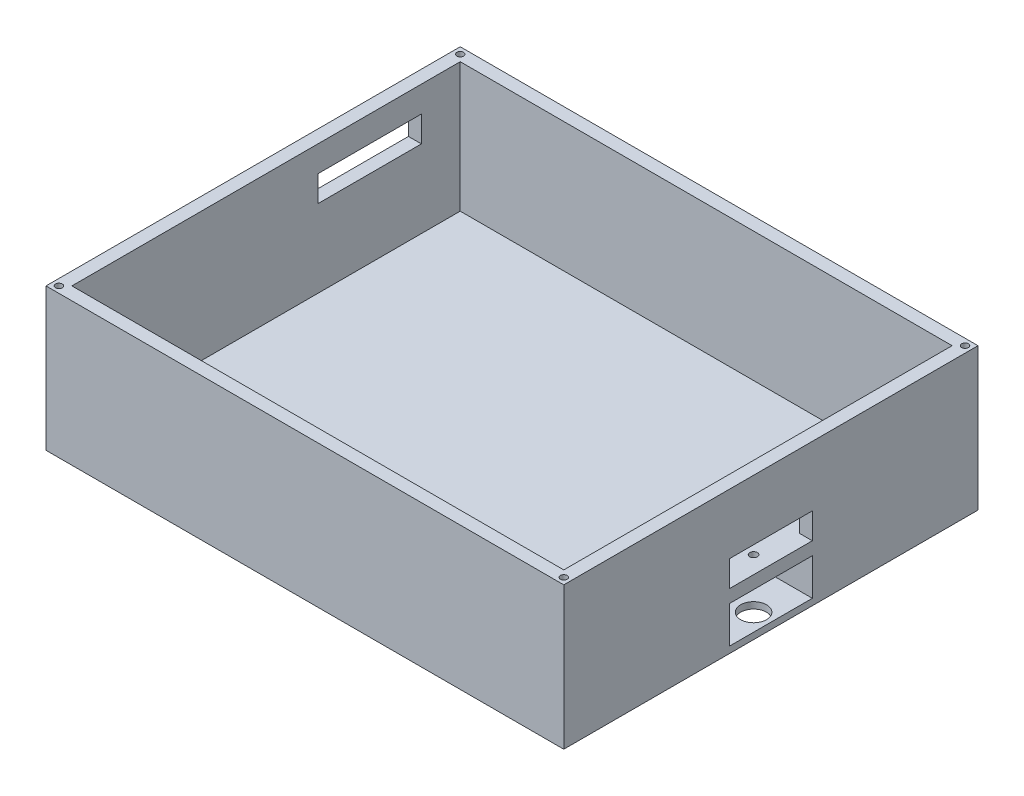
ISO-10303-21;
HEADER;
FILE_DESCRIPTION(('STEP AP214'),'2;1');
FILE_NAME('part.step','',(''),(''),'','','');
FILE_SCHEMA(('AUTOMOTIVE_DESIGN { 1 0 10303 214 1 1 1 1 }'));
ENDSEC;
DATA;
#1=APPLICATION_CONTEXT('core data for automotive mechanical design processes');
#2=APPLICATION_PROTOCOL_DEFINITION('international standard','automotive_design',2000,#1);
#3=PRODUCT_CONTEXT('',#1,'mechanical');
#4=PRODUCT('Part','Part','',(#3));
#5=PRODUCT_RELATED_PRODUCT_CATEGORY('part','',(#4));
#6=PRODUCT_DEFINITION_FORMATION('','',#4);
#7=PRODUCT_DEFINITION_CONTEXT('part definition',#1,'design');
#8=PRODUCT_DEFINITION('design','',#6,#7);
#9=PRODUCT_DEFINITION_SHAPE('','',#8);
#10=(LENGTH_UNIT() NAMED_UNIT(*) SI_UNIT(.MILLI.,.METRE.));
#11=(NAMED_UNIT(*) PLANE_ANGLE_UNIT() SI_UNIT($,.RADIAN.));
#12=(NAMED_UNIT(*) SI_UNIT($,.STERADIAN.) SOLID_ANGLE_UNIT());
#13=UNCERTAINTY_MEASURE_WITH_UNIT(LENGTH_MEASURE(1.E-05),#10,'distance_accuracy_value','');
#14=(GEOMETRIC_REPRESENTATION_CONTEXT(3) GLOBAL_UNCERTAINTY_ASSIGNED_CONTEXT((#13)) GLOBAL_UNIT_ASSIGNED_CONTEXT((#10,
#11,#12)) REPRESENTATION_CONTEXT('',''));
#15=CARTESIAN_POINT('',(0.,0.,0.));
#16=DIRECTION('',(0.,0.,1.));
#17=DIRECTION('',(1.,0.,0.));
#18=AXIS2_PLACEMENT_3D('',#15,#16,#17);
#19=CARTESIAN_POINT('',(120.65,-34.7831022413822,20.32));
#20=DIRECTION('',(0.,0.,1.));
#21=DIRECTION('',(1.,0.,0.));
#22=AXIS2_PLACEMENT_3D('',#19,#20,#21);
#23=PLANE('',#22);
#24=DIRECTION('',(-1.,0.,0.));
#25=VECTOR('',#24,1.);
#26=CARTESIAN_POINT('',(120.65,21.262951806,20.32));
#27=LINE('',#26,#25);
#28=CARTESIAN_POINT('',(127.,21.262951806,20.32));
#29=VERTEX_POINT('',#28);
#30=CARTESIAN_POINT('',(88.9,21.262951806,20.32));
#31=VERTEX_POINT('',#30);
#32=EDGE_CURVE('E266',#29,#31,#27,.T.);
#33=ORIENTED_EDGE('',*,*,#32,.F.);
#34=DIRECTION('',(0.,1.,0.));
#35=VECTOR('',#34,1.);
#36=CARTESIAN_POINT('',(127.,-34.7831022413822,20.32));
#37=LINE('',#36,#35);
#38=CARTESIAN_POINT('',(127.,3.175,20.32));
#39=VERTEX_POINT('',#38);
#40=EDGE_CURVE('E348',#39,#29,#37,.T.);
#41=ORIENTED_EDGE('',*,*,#40,.F.);
#42=DIRECTION('',(1.,0.,0.));
#43=VECTOR('',#42,1.);
#44=CARTESIAN_POINT('',(127.,3.175,20.32));
#45=LINE('',#44,#43);
#46=CARTESIAN_POINT('',(76.2,3.175,20.32));
#47=VERTEX_POINT('',#46);
#48=EDGE_CURVE('E325',#47,#39,#45,.T.);
#49=ORIENTED_EDGE('',*,*,#48,.F.);
#50=DIRECTION('',(0.,1.,0.));
#51=VECTOR('',#50,1.);
#52=CARTESIAN_POINT('',(76.2,3.175,20.32));
#53=LINE('',#52,#51);
#54=CARTESIAN_POINT('',(76.2,6.35,20.32));
#55=VERTEX_POINT('',#54);
#56=EDGE_CURVE('E335',#47,#55,#53,.T.);
#57=ORIENTED_EDGE('',*,*,#56,.T.);
#58=DIRECTION('',(1.,0.,0.));
#59=VECTOR('',#58,1.);
#60=CARTESIAN_POINT('',(127.,6.35,20.32));
#61=LINE('',#60,#59);
#62=CARTESIAN_POINT('',(88.9,6.35,20.32));
#63=VERTEX_POINT('',#62);
#64=EDGE_CURVE('E319',#55,#63,#61,.T.);
#65=ORIENTED_EDGE('',*,*,#64,.T.);
#66=DIRECTION('',(0.,-1.,0.));
#67=VECTOR('',#66,1.);
#68=CARTESIAN_POINT('',(88.9,53.6417257173142,20.32));
#69=LINE('',#68,#67);
#70=EDGE_CURVE('E270',#31,#63,#69,.T.);
#71=ORIENTED_EDGE('',*,*,#70,.F.);
#72=EDGE_LOOP('',(#33,#41,#49,#57,#65,#71));
#73=FACE_BOUND('',#72,.T.);
#74=ADVANCED_FACE('F41',(#73),#23,.F.);
#75=CARTESIAN_POINT('',(120.65,-34.7831022413822,-20.32));
#76=DIRECTION('',(0.,0.,-1.));
#77=DIRECTION('',(-1.,0.,0.));
#78=AXIS2_PLACEMENT_3D('',#75,#76,#77);
#79=PLANE('',#78);
#80=DIRECTION('',(0.,1.,0.));
#81=VECTOR('',#80,1.);
#82=CARTESIAN_POINT('',(127.,-34.7831022413822,-20.32));
#83=LINE('',#82,#81);
#84=CARTESIAN_POINT('',(127.,3.175,-20.32));
#85=VERTEX_POINT('',#84);
#86=CARTESIAN_POINT('',(127.,21.262951806,-20.32));
#87=VERTEX_POINT('',#86);
#88=EDGE_CURVE('E344',#85,#87,#83,.T.);
#89=ORIENTED_EDGE('',*,*,#88,.T.);
#90=DIRECTION('',(-1.,0.,0.));
#91=VECTOR('',#90,1.);
#92=CARTESIAN_POINT('',(120.65,21.262951806,-20.32));
#93=LINE('',#92,#91);
#94=CARTESIAN_POINT('',(88.9,21.262951806,-20.32));
#95=VERTEX_POINT('',#94);
#96=EDGE_CURVE('E311',#87,#95,#93,.T.);
#97=ORIENTED_EDGE('',*,*,#96,.T.);
#98=DIRECTION('',(0.,-1.,0.));
#99=VECTOR('',#98,1.);
#100=CARTESIAN_POINT('',(88.9,53.6417257173142,-20.32));
#101=LINE('',#100,#99);
#102=CARTESIAN_POINT('',(88.9,6.35,-20.32));
#103=VERTEX_POINT('',#102);
#104=EDGE_CURVE('E302',#95,#103,#101,.T.);
#105=ORIENTED_EDGE('',*,*,#104,.T.);
#106=DIRECTION('',(-1.,0.,0.));
#107=VECTOR('',#106,1.);
#108=CARTESIAN_POINT('',(127.,6.35,-20.32));
#109=LINE('',#108,#107);
#110=CARTESIAN_POINT('',(76.2,6.35,-20.32));
#111=VERTEX_POINT('',#110);
#112=EDGE_CURVE('E314',#103,#111,#109,.T.);
#113=ORIENTED_EDGE('',*,*,#112,.T.);
#114=DIRECTION('',(0.,1.,0.));
#115=VECTOR('',#114,1.);
#116=CARTESIAN_POINT('',(76.2,3.175,-20.32));
#117=LINE('',#116,#115);
#118=CARTESIAN_POINT('',(76.2,3.175,-20.32));
#119=VERTEX_POINT('',#118);
#120=EDGE_CURVE('E328',#119,#111,#117,.T.);
#121=ORIENTED_EDGE('',*,*,#120,.F.);
#122=DIRECTION('',(-1.,0.,0.));
#123=VECTOR('',#122,1.);
#124=CARTESIAN_POINT('',(127.,3.175,-20.32));
#125=LINE('',#124,#123);
#126=EDGE_CURVE('E318',#85,#119,#125,.T.);
#127=ORIENTED_EDGE('',*,*,#126,.F.);
#128=EDGE_LOOP('',(#89,#97,#105,#113,#121,#127));
#129=FACE_BOUND('',#128,.T.);
#130=ADVANCED_FACE('F575',(#129),#79,.F.);
#131=CARTESIAN_POINT('',(0.,6.35,0.));
#132=DIRECTION('',(0.,-1.,0.));
#133=DIRECTION('',(0.,0.,-1.));
#134=AXIS2_PLACEMENT_3D('',#131,#132,#133);
#135=PLANE('',#134);
#136=DIRECTION('',(-1.,0.,0.));
#137=VECTOR('',#136,1.);
#138=CARTESIAN_POINT('',(120.65,6.35,26.67));
#139=LINE('',#138,#137);
#140=CARTESIAN_POINT('',(120.65,6.35,26.67));
#141=VERTEX_POINT('',#140);
#142=CARTESIAN_POINT('',(88.9,6.35,26.67));
#143=VERTEX_POINT('',#142);
#144=EDGE_CURVE('E273',#141,#143,#139,.T.);
#145=ORIENTED_EDGE('',*,*,#144,.T.);
#146=DIRECTION('',(0.,0.,-1.));
#147=VECTOR('',#146,1.);
#148=CARTESIAN_POINT('',(88.9,6.35,20.32));
#149=LINE('',#148,#147);
#150=EDGE_CURVE('E265',#143,#63,#149,.T.);
#151=ORIENTED_EDGE('',*,*,#150,.T.);
#152=ORIENTED_EDGE('',*,*,#64,.F.);
#153=DIRECTION('',(0.,0.,1.));
#154=VECTOR('',#153,1.);
#155=CARTESIAN_POINT('',(76.2,6.35,-20.32));
#156=LINE('',#155,#154);
#157=EDGE_CURVE('E330',#111,#55,#156,.T.);
#158=ORIENTED_EDGE('',*,*,#157,.F.);
#159=ORIENTED_EDGE('',*,*,#112,.F.);
#160=DIRECTION('',(0.,0.,1.));
#161=VECTOR('',#160,1.);
#162=CARTESIAN_POINT('',(88.9,6.35,-20.32));
#163=LINE('',#162,#161);
#164=CARTESIAN_POINT('',(88.9,6.35,-26.67));
#165=VERTEX_POINT('',#164);
#166=EDGE_CURVE('E299',#165,#103,#163,.T.);
#167=ORIENTED_EDGE('',*,*,#166,.F.);
#168=DIRECTION('',(-1.,0.,0.));
#169=VECTOR('',#168,1.);
#170=CARTESIAN_POINT('',(120.65,6.35,-26.67));
#171=LINE('',#170,#169);
#172=CARTESIAN_POINT('',(120.65,6.35,-26.67));
#173=VERTEX_POINT('',#172);
#174=EDGE_CURVE('E296',#173,#165,#171,.T.);
#175=ORIENTED_EDGE('',*,*,#174,.F.);
#176=DIRECTION('',(0.,0.,1.));
#177=VECTOR('',#176,1.);
#178=CARTESIAN_POINT('',(120.65,6.35,0.));
#179=LINE('',#178,#177);
#180=CARTESIAN_POINT('',(120.65,6.35,-95.25));
#181=VERTEX_POINT('',#180);
#182=EDGE_CURVE('E373',#181,#173,#179,.T.);
#183=ORIENTED_EDGE('',*,*,#182,.F.);
#184=DIRECTION('',(1.,0.,0.));
#185=VECTOR('',#184,1.);
#186=CARTESIAN_POINT('',(0.,6.35,-95.25));
#187=LINE('',#186,#185);
#188=CARTESIAN_POINT('',(-120.65,6.35,-95.25));
#189=VERTEX_POINT('',#188);
#190=EDGE_CURVE('E356',#189,#181,#187,.T.);
#191=ORIENTED_EDGE('',*,*,#190,.F.);
#192=DIRECTION('',(0.,0.,-1.));
#193=VECTOR('',#192,1.);
#194=CARTESIAN_POINT('',(-120.65,6.35,0.));
#195=LINE('',#194,#193);
#196=CARTESIAN_POINT('',(-120.65,6.35,95.25));
#197=VERTEX_POINT('',#196);
#198=EDGE_CURVE('E379',#197,#189,#195,.T.);
#199=ORIENTED_EDGE('',*,*,#198,.F.);
#200=DIRECTION('',(-1.,0.,0.));
#201=VECTOR('',#200,1.);
#202=CARTESIAN_POINT('',(0.,6.35,95.25));
#203=LINE('',#202,#201);
#204=CARTESIAN_POINT('',(120.65,6.35,95.25));
#205=VERTEX_POINT('',#204);
#206=EDGE_CURVE('E376',#205,#197,#203,.T.);
#207=ORIENTED_EDGE('',*,*,#206,.F.);
#208=EDGE_CURVE('E352',#141,#205,#179,.T.);
#209=ORIENTED_EDGE('',*,*,#208,.F.);
#210=EDGE_LOOP('',(#145,#151,#152,#158,#159,#167,#175,#183,#191,#199,#207,#209));
#211=FACE_BOUND('',#210,.T.);
#212=ADVANCED_FACE('F457',(#211),#135,.F.);
#213=CARTESIAN_POINT('',(120.65,69.85,0.));
#214=DIRECTION('',(1.,0.,0.));
#215=DIRECTION('',(0.,0.,-1.));
#216=AXIS2_PLACEMENT_3D('',#213,#214,#215);
#217=PLANE('',#216);
#218=DIRECTION('',(0.,0.,1.));
#219=VECTOR('',#218,1.);
#220=CARTESIAN_POINT('',(120.65,27.612951806,0.));
#221=LINE('',#220,#219);
#222=CARTESIAN_POINT('',(120.65,27.612951806,20.32));
#223=VERTEX_POINT('',#222);
#224=CARTESIAN_POINT('',(120.65,27.612951806,26.67));
#225=VERTEX_POINT('',#224);
#226=EDGE_CURVE('E262',#223,#225,#221,.T.);
#227=ORIENTED_EDGE('',*,*,#226,.T.);
#228=DIRECTION('',(0.,-1.,0.));
#229=VECTOR('',#228,1.);
#230=CARTESIAN_POINT('',(120.65,53.6417257173142,26.67));
#231=LINE('',#230,#229);
#232=EDGE_CURVE('E276',#225,#141,#231,.T.);
#233=ORIENTED_EDGE('',*,*,#232,.T.);
#234=ORIENTED_EDGE('',*,*,#208,.T.);
#235=DIRECTION('',(0.,-1.,0.));
#236=VECTOR('',#235,1.);
#237=CARTESIAN_POINT('',(120.65,69.85,95.25));
#238=LINE('',#237,#236);
#239=CARTESIAN_POINT('',(120.65,69.85,95.25));
#240=VERTEX_POINT('',#239);
#241=EDGE_CURVE('E392',#240,#205,#238,.T.);
#242=ORIENTED_EDGE('',*,*,#241,.F.);
#243=DIRECTION('',(0.,0.,1.));
#244=VECTOR('',#243,1.);
#245=CARTESIAN_POINT('',(120.65,69.85,0.));
#246=LINE('',#245,#244);
#247=CARTESIAN_POINT('',(120.65,69.85,-95.25));
#248=VERTEX_POINT('',#247);
#249=EDGE_CURVE('E353',#248,#240,#246,.T.);
#250=ORIENTED_EDGE('',*,*,#249,.F.);
#251=DIRECTION('',(0.,-1.,0.));
#252=VECTOR('',#251,1.);
#253=CARTESIAN_POINT('',(120.65,69.85,-95.25));
#254=LINE('',#253,#252);
#255=EDGE_CURVE('E372',#248,#181,#254,.T.);
#256=ORIENTED_EDGE('',*,*,#255,.T.);
#257=ORIENTED_EDGE('',*,*,#182,.T.);
#258=DIRECTION('',(0.,-1.,0.));
#259=VECTOR('',#258,1.);
#260=CARTESIAN_POINT('',(120.65,53.6417257173142,-26.67));
#261=LINE('',#260,#259);
#262=CARTESIAN_POINT('',(120.65,27.612951806,-26.67));
#263=VERTEX_POINT('',#262);
#264=EDGE_CURVE('E308',#263,#173,#261,.T.);
#265=ORIENTED_EDGE('',*,*,#264,.F.);
#266=DIRECTION('',(0.,0.,1.));
#267=VECTOR('',#266,1.);
#268=CARTESIAN_POINT('',(120.65,27.612951806,0.));
#269=LINE('',#268,#267);
#270=CARTESIAN_POINT('',(120.65,27.612951806,-20.32));
#271=VERTEX_POINT('',#270);
#272=EDGE_CURVE('E290',#263,#271,#269,.T.);
#273=ORIENTED_EDGE('',*,*,#272,.T.);
#274=DIRECTION('',(0.,1.,0.));
#275=VECTOR('',#274,1.);
#276=CARTESIAN_POINT('',(120.65,-34.7831022413822,-20.32));
#277=LINE('',#276,#275);
#278=CARTESIAN_POINT('',(120.65,40.312951806,-20.32));
#279=VERTEX_POINT('',#278);
#280=EDGE_CURVE('E340',#271,#279,#277,.T.);
#281=ORIENTED_EDGE('',*,*,#280,.T.);
#282=DIRECTION('',(0.,0.,1.));
#283=VECTOR('',#282,1.);
#284=CARTESIAN_POINT('',(120.65,40.312951806,20.32));
#285=LINE('',#284,#283);
#286=CARTESIAN_POINT('',(120.65,40.312951806,20.32));
#287=VERTEX_POINT('',#286);
#288=EDGE_CURVE('E477',#279,#287,#285,.T.);
#289=ORIENTED_EDGE('',*,*,#288,.T.);
#290=DIRECTION('',(0.,1.,0.));
#291=VECTOR('',#290,1.);
#292=CARTESIAN_POINT('',(120.65,-34.7831022413822,20.32));
#293=LINE('',#292,#291);
#294=EDGE_CURVE('E343',#223,#287,#293,.T.);
#295=ORIENTED_EDGE('',*,*,#294,.F.);
#296=EDGE_LOOP('',(#227,#233,#234,#242,#250,#256,#257,#265,#273,#281,#289,#295));
#297=FACE_BOUND('',#296,.T.);
#298=ADVANCED_FACE('F451',(#297),#217,.F.);
#299=CARTESIAN_POINT('',(127.,6.35,101.6));
#300=DIRECTION('',(-1.,0.,0.));
#301=DIRECTION('',(0.,0.,1.));
#302=AXIS2_PLACEMENT_3D('',#299,#300,#301);
#303=PLANE('',#302);
#304=CARTESIAN_POINT('',(127.,27.612951806,20.32));
#305=VERTEX_POINT('',#304);
#306=CARTESIAN_POINT('',(127.,40.312951806,20.32));
#307=VERTEX_POINT('',#306);
#308=EDGE_CURVE('E337',#305,#307,#37,.T.);
#309=ORIENTED_EDGE('',*,*,#308,.T.);
#310=DIRECTION('',(0.,0.,-1.));
#311=VECTOR('',#310,1.);
#312=CARTESIAN_POINT('',(127.,40.312951806,20.32));
#313=LINE('',#312,#311);
#314=CARTESIAN_POINT('',(127.,40.312951806,-20.32));
#315=VERTEX_POINT('',#314);
#316=EDGE_CURVE('E487',#307,#315,#313,.T.);
#317=ORIENTED_EDGE('',*,*,#316,.T.);
#318=CARTESIAN_POINT('',(127.,27.612951806,-20.32));
#319=VERTEX_POINT('',#318);
#320=EDGE_CURVE('E347',#319,#315,#83,.T.);
#321=ORIENTED_EDGE('',*,*,#320,.F.);
#322=DIRECTION('',(0.,0.,-1.));
#323=VECTOR('',#322,1.);
#324=CARTESIAN_POINT('',(127.,27.612951806,-26.67));
#325=LINE('',#324,#323);
#326=EDGE_CURVE('E284',#305,#319,#325,.T.);
#327=ORIENTED_EDGE('',*,*,#326,.F.);
#328=EDGE_LOOP('',(#309,#317,#321,#327));
#329=FACE_BOUND('',#328,.T.);
#330=DIRECTION('',(0.,-1.,0.));
#331=VECTOR('',#330,1.);
#332=CARTESIAN_POINT('',(127.,6.35,-101.6));
#333=LINE('',#332,#331);
#334=CARTESIAN_POINT('',(127.,69.85,-101.6));
#335=VERTEX_POINT('',#334);
#336=CARTESIAN_POINT('',(127.,0.,-101.6));
#337=VERTEX_POINT('',#336);
#338=EDGE_CURVE('E49',#335,#337,#333,.T.);
#339=ORIENTED_EDGE('',*,*,#338,.F.);
#340=DIRECTION('',(0.,0.,-1.));
#341=VECTOR('',#340,1.);
#342=CARTESIAN_POINT('',(127.,69.85,0.));
#343=LINE('',#342,#341);
#344=CARTESIAN_POINT('',(127.,69.85,101.6));
#345=VERTEX_POINT('',#344);
#346=EDGE_CURVE('E367',#345,#335,#343,.T.);
#347=ORIENTED_EDGE('',*,*,#346,.F.);
#348=DIRECTION('',(0.,-1.,0.));
#349=VECTOR('',#348,1.);
#350=CARTESIAN_POINT('',(127.,6.35,101.6));
#351=LINE('',#350,#349);
#352=CARTESIAN_POINT('',(127.,0.,101.6));
#353=VERTEX_POINT('',#352);
#354=EDGE_CURVE('E404',#345,#353,#351,.T.);
#355=ORIENTED_EDGE('',*,*,#354,.T.);
#356=DIRECTION('',(0.,0.,-1.));
#357=VECTOR('',#356,1.);
#358=CARTESIAN_POINT('',(127.,0.,101.6));
#359=LINE('',#358,#357);
#360=EDGE_CURVE('E395',#353,#337,#359,.T.);
#361=ORIENTED_EDGE('',*,*,#360,.T.);
#362=EDGE_LOOP('',(#339,#347,#355,#361));
#363=FACE_BOUND('',#362,.T.);
#364=ORIENTED_EDGE('',*,*,#40,.T.);
#365=DIRECTION('',(0.,0.,-1.));
#366=VECTOR('',#365,1.);
#367=CARTESIAN_POINT('',(127.,21.262951806,-26.67));
#368=LINE('',#367,#366);
#369=EDGE_CURVE('E285',#29,#87,#368,.T.);
#370=ORIENTED_EDGE('',*,*,#369,.T.);
#371=ORIENTED_EDGE('',*,*,#88,.F.);
#372=DIRECTION('',(0.,0.,-1.));
#373=VECTOR('',#372,1.);
#374=CARTESIAN_POINT('',(127.,3.175,-20.32));
#375=LINE('',#374,#373);
#376=EDGE_CURVE('E315',#39,#85,#375,.T.);
#377=ORIENTED_EDGE('',*,*,#376,.F.);
#378=EDGE_LOOP('',(#364,#370,#371,#377));
#379=FACE_BOUND('',#378,.T.);
#380=ADVANCED_FACE('F43',(#329,#363,#379),#303,.F.);
#381=CARTESIAN_POINT('',(-127.,6.35,-101.6));
#382=DIRECTION('',(0.,0.,1.));
#383=DIRECTION('',(1.,0.,0.));
#384=AXIS2_PLACEMENT_3D('',#381,#382,#383);
#385=PLANE('',#384);
#386=DIRECTION('',(-1.,0.,0.));
#387=VECTOR('',#386,1.);
#388=CARTESIAN_POINT('',(-127.,0.,-101.6));
#389=LINE('',#388,#387);
#390=CARTESIAN_POINT('',(-127.,0.,-101.6));
#391=VERTEX_POINT('',#390);
#392=EDGE_CURVE('E398',#337,#391,#389,.T.);
#393=ORIENTED_EDGE('',*,*,#392,.T.);
#394=DIRECTION('',(0.,-1.,0.));
#395=VECTOR('',#394,1.);
#396=CARTESIAN_POINT('',(-127.,6.35,-101.6));
#397=LINE('',#396,#395);
#398=CARTESIAN_POINT('',(-127.,69.85,-101.6));
#399=VERTEX_POINT('',#398);
#400=EDGE_CURVE('E410',#399,#391,#397,.T.);
#401=ORIENTED_EDGE('',*,*,#400,.F.);
#402=DIRECTION('',(-1.,0.,0.));
#403=VECTOR('',#402,1.);
#404=CARTESIAN_POINT('',(0.,69.85,-101.6));
#405=LINE('',#404,#403);
#406=EDGE_CURVE('E369',#335,#399,#405,.T.);
#407=ORIENTED_EDGE('',*,*,#406,.F.);
#408=ORIENTED_EDGE('',*,*,#338,.T.);
#409=EDGE_LOOP('',(#393,#401,#407,#408));
#410=FACE_BOUND('',#409,.T.);
#411=ADVANCED_FACE('F416',(#410),#385,.F.);
#412=CARTESIAN_POINT('',(-127.,6.35,101.6));
#413=DIRECTION('',(1.,0.,0.));
#414=DIRECTION('',(0.,0.,-1.));
#415=AXIS2_PLACEMENT_3D('',#412,#413,#414);
#416=PLANE('',#415);
#417=DIRECTION('',(0.,1.,0.));
#418=VECTOR('',#417,1.);
#419=CARTESIAN_POINT('',(-127.,44.45,-76.2));
#420=LINE('',#419,#418);
#421=CARTESIAN_POINT('',(-127.,44.45,-76.2));
#422=VERTEX_POINT('',#421);
#423=CARTESIAN_POINT('',(-127.,57.15,-76.2));
#424=VERTEX_POINT('',#423);
#425=EDGE_CURVE('E229',#422,#424,#420,.T.);
#426=ORIENTED_EDGE('',*,*,#425,.T.);
#427=DIRECTION('',(0.,0.,1.));
#428=VECTOR('',#427,1.);
#429=CARTESIAN_POINT('',(-127.,57.15,-76.2));
#430=LINE('',#429,#428);
#431=CARTESIAN_POINT('',(-127.,57.15,-25.4));
#432=VERTEX_POINT('',#431);
#433=EDGE_CURVE('E217',#424,#432,#430,.T.);
#434=ORIENTED_EDGE('',*,*,#433,.T.);
#435=DIRECTION('',(0.,1.,0.));
#436=VECTOR('',#435,1.);
#437=CARTESIAN_POINT('',(-127.,44.45,-25.4));
#438=LINE('',#437,#436);
#439=CARTESIAN_POINT('',(-127.,44.45,-25.4));
#440=VERTEX_POINT('',#439);
#441=EDGE_CURVE('E228',#440,#432,#438,.T.);
#442=ORIENTED_EDGE('',*,*,#441,.F.);
#443=DIRECTION('',(0.,0.,1.));
#444=VECTOR('',#443,1.);
#445=CARTESIAN_POINT('',(-127.,44.45,-76.2));
#446=LINE('',#445,#444);
#447=EDGE_CURVE('E504',#422,#440,#446,.T.);
#448=ORIENTED_EDGE('',*,*,#447,.F.);
#449=EDGE_LOOP('',(#426,#434,#442,#448));
#450=FACE_BOUND('',#449,.T.);
#451=DIRECTION('',(0.,-1.,0.));
#452=VECTOR('',#451,1.);
#453=CARTESIAN_POINT('',(-127.,6.35,101.6));
#454=LINE('',#453,#452);
#455=CARTESIAN_POINT('',(-127.,69.85,101.6));
#456=VERTEX_POINT('',#455);
#457=CARTESIAN_POINT('',(-127.,0.,101.6));
#458=VERTEX_POINT('',#457);
#459=EDGE_CURVE('E407',#456,#458,#454,.T.);
#460=ORIENTED_EDGE('',*,*,#459,.F.);
#461=DIRECTION('',(0.,0.,1.));
#462=VECTOR('',#461,1.);
#463=CARTESIAN_POINT('',(-127.,69.85,0.));
#464=LINE('',#463,#462);
#465=EDGE_CURVE('E362',#399,#456,#464,.T.);
#466=ORIENTED_EDGE('',*,*,#465,.F.);
#467=ORIENTED_EDGE('',*,*,#400,.T.);
#468=DIRECTION('',(0.,0.,1.));
#469=VECTOR('',#468,1.);
#470=CARTESIAN_POINT('',(-127.,0.,101.6));
#471=LINE('',#470,#469);
#472=EDGE_CURVE('E400',#391,#458,#471,.T.);
#473=ORIENTED_EDGE('',*,*,#472,.T.);
#474=EDGE_LOOP('',(#460,#466,#467,#473));
#475=FACE_BOUND('',#474,.T.);
#476=ADVANCED_FACE('F225',(#450,#475),#416,.F.);
#477=CARTESIAN_POINT('',(-127.,6.35,101.6));
#478=DIRECTION('',(0.,0.,-1.));
#479=DIRECTION('',(-1.,0.,0.));
#480=AXIS2_PLACEMENT_3D('',#477,#478,#479);
#481=PLANE('',#480);
#482=DIRECTION('',(1.,0.,0.));
#483=VECTOR('',#482,1.);
#484=CARTESIAN_POINT('',(-127.,0.,101.6));
#485=LINE('',#484,#483);
#486=EDGE_CURVE('E402',#458,#353,#485,.T.);
#487=ORIENTED_EDGE('',*,*,#486,.T.);
#488=ORIENTED_EDGE('',*,*,#354,.F.);
#489=DIRECTION('',(1.,0.,0.));
#490=VECTOR('',#489,1.);
#491=CARTESIAN_POINT('',(0.,69.85,101.6));
#492=LINE('',#491,#490);
#493=EDGE_CURVE('E364',#456,#345,#492,.T.);
#494=ORIENTED_EDGE('',*,*,#493,.F.);
#495=ORIENTED_EDGE('',*,*,#459,.T.);
#496=EDGE_LOOP('',(#487,#488,#494,#495));
#497=FACE_BOUND('',#496,.T.);
#498=ADVANCED_FACE('F429',(#497),#481,.F.);
#499=CARTESIAN_POINT('',(0.,0.,0.));
#500=DIRECTION('',(0.,-1.,0.));
#501=DIRECTION('',(0.,0.,-1.));
#502=AXIS2_PLACEMENT_3D('',#499,#500,#501);
#503=PLANE('',#502);
#504=CARTESIAN_POINT('',(99.4,0.,0.));
#505=DIRECTION('',(0.,-1.,0.));
#506=DIRECTION('',(0.,0.,-1.));
#507=AXIS2_PLACEMENT_3D('',#504,#505,#506);
#508=CIRCLE('',#507,6.34999999999997);
#509=CARTESIAN_POINT('',(99.4,0.,-6.34999999999998));
#510=VERTEX_POINT('',#509);
#511=EDGE_CURVE('E505',#510,#510,#508,.T.);
#512=ORIENTED_EDGE('',*,*,#511,.F.);
#513=EDGE_LOOP('',(#512));
#514=FACE_BOUND('',#513,.T.);
#515=CARTESIAN_POINT('',(118.5,0.,0.));
#516=DIRECTION('',(0.,-1.,0.));
#517=DIRECTION('',(0.,0.,-1.));
#518=AXIS2_PLACEMENT_3D('',#515,#516,#517);
#519=CIRCLE('',#518,6.34999999999997);
#520=CARTESIAN_POINT('',(118.5,0.,-6.34999999999998));
#521=VERTEX_POINT('',#520);
#522=EDGE_CURVE('E508',#521,#521,#519,.T.);
#523=ORIENTED_EDGE('',*,*,#522,.F.);
#524=EDGE_LOOP('',(#523));
#525=FACE_BOUND('',#524,.T.);
#526=ORIENTED_EDGE('',*,*,#360,.F.);
#527=ORIENTED_EDGE('',*,*,#486,.F.);
#528=ORIENTED_EDGE('',*,*,#472,.F.);
#529=ORIENTED_EDGE('',*,*,#392,.F.);
#530=EDGE_LOOP('',(#526,#527,#528,#529));
#531=FACE_BOUND('',#530,.T.);
#532=ADVANCED_FACE('F423',(#514,#525,#531),#503,.T.);
#533=CARTESIAN_POINT('',(0.,69.85,95.25));
#534=DIRECTION('',(0.,0.,1.));
#535=DIRECTION('',(1.,0.,0.));
#536=AXIS2_PLACEMENT_3D('',#533,#534,#535);
#537=PLANE('',#536);
#538=ORIENTED_EDGE('',*,*,#206,.T.);
#539=DIRECTION('',(0.,-1.,0.));
#540=VECTOR('',#539,1.);
#541=CARTESIAN_POINT('',(-120.65,69.85,95.25));
#542=LINE('',#541,#540);
#543=CARTESIAN_POINT('',(-120.65,69.85,95.25));
#544=VERTEX_POINT('',#543);
#545=EDGE_CURVE('E389',#544,#197,#542,.T.);
#546=ORIENTED_EDGE('',*,*,#545,.F.);
#547=DIRECTION('',(-1.,0.,0.));
#548=VECTOR('',#547,1.);
#549=CARTESIAN_POINT('',(0.,69.85,95.25));
#550=LINE('',#549,#548);
#551=EDGE_CURVE('E355',#240,#544,#550,.T.);
#552=ORIENTED_EDGE('',*,*,#551,.F.);
#553=ORIENTED_EDGE('',*,*,#241,.T.);
#554=EDGE_LOOP('',(#538,#546,#552,#553));
#555=FACE_BOUND('',#554,.T.);
#556=ADVANCED_FACE('F453',(#555),#537,.F.);
#557=CARTESIAN_POINT('',(-120.65,69.85,0.));
#558=DIRECTION('',(-1.,0.,0.));
#559=DIRECTION('',(0.,0.,1.));
#560=AXIS2_PLACEMENT_3D('',#557,#558,#559);
#561=PLANE('',#560);
#562=DIRECTION('',(0.,-1.,0.));
#563=VECTOR('',#562,1.);
#564=CARTESIAN_POINT('',(-120.65,69.85,-95.25));
#565=LINE('',#564,#563);
#566=CARTESIAN_POINT('',(-120.65,69.85,-95.25));
#567=VERTEX_POINT('',#566);
#568=EDGE_CURVE('E386',#567,#189,#565,.T.);
#569=ORIENTED_EDGE('',*,*,#568,.F.);
#570=DIRECTION('',(0.,0.,-1.));
#571=VECTOR('',#570,1.);
#572=CARTESIAN_POINT('',(-120.65,69.85,0.));
#573=LINE('',#572,#571);
#574=EDGE_CURVE('E358',#544,#567,#573,.T.);
#575=ORIENTED_EDGE('',*,*,#574,.F.);
#576=ORIENTED_EDGE('',*,*,#545,.T.);
#577=ORIENTED_EDGE('',*,*,#198,.T.);
#578=EDGE_LOOP('',(#569,#575,#576,#577));
#579=FACE_BOUND('',#578,.T.);
#580=DIRECTION('',(0.,0.,-1.));
#581=VECTOR('',#580,1.);
#582=CARTESIAN_POINT('',(-120.65,57.15,-76.2));
#583=LINE('',#582,#581);
#584=CARTESIAN_POINT('',(-120.65,57.15,-25.4));
#585=VERTEX_POINT('',#584);
#586=CARTESIAN_POINT('',(-120.65,57.15,-76.2));
#587=VERTEX_POINT('',#586);
#588=EDGE_CURVE('E218',#585,#587,#583,.T.);
#589=ORIENTED_EDGE('',*,*,#588,.T.);
#590=DIRECTION('',(0.,1.,0.));
#591=VECTOR('',#590,1.);
#592=CARTESIAN_POINT('',(-120.65,44.45,-76.2));
#593=LINE('',#592,#591);
#594=CARTESIAN_POINT('',(-120.65,44.45,-76.2));
#595=VERTEX_POINT('',#594);
#596=EDGE_CURVE('E56',#595,#587,#593,.T.);
#597=ORIENTED_EDGE('',*,*,#596,.F.);
#598=DIRECTION('',(0.,0.,-1.));
#599=VECTOR('',#598,1.);
#600=CARTESIAN_POINT('',(-120.65,44.45,-76.2));
#601=LINE('',#600,#599);
#602=CARTESIAN_POINT('',(-120.65,44.45,-25.4));
#603=VERTEX_POINT('',#602);
#604=EDGE_CURVE('E241',#603,#595,#601,.T.);
#605=ORIENTED_EDGE('',*,*,#604,.F.);
#606=DIRECTION('',(0.,1.,0.));
#607=VECTOR('',#606,1.);
#608=CARTESIAN_POINT('',(-120.65,44.45,-25.4));
#609=LINE('',#608,#607);
#610=EDGE_CURVE('E236',#603,#585,#609,.T.);
#611=ORIENTED_EDGE('',*,*,#610,.T.);
#612=EDGE_LOOP('',(#589,#597,#605,#611));
#613=FACE_BOUND('',#612,.T.);
#614=ADVANCED_FACE('F445',(#579,#613),#561,.F.);
#615=CARTESIAN_POINT('',(0.,69.85,-95.25));
#616=DIRECTION('',(0.,0.,-1.));
#617=DIRECTION('',(-1.,0.,0.));
#618=AXIS2_PLACEMENT_3D('',#615,#616,#617);
#619=PLANE('',#618);
#620=ORIENTED_EDGE('',*,*,#190,.T.);
#621=ORIENTED_EDGE('',*,*,#255,.F.);
#622=DIRECTION('',(1.,0.,0.));
#623=VECTOR('',#622,1.);
#624=CARTESIAN_POINT('',(0.,69.85,-95.25));
#625=LINE('',#624,#623);
#626=EDGE_CURVE('E360',#567,#248,#625,.T.);
#627=ORIENTED_EDGE('',*,*,#626,.F.);
#628=ORIENTED_EDGE('',*,*,#568,.T.);
#629=EDGE_LOOP('',(#620,#621,#627,#628));
#630=FACE_BOUND('',#629,.T.);
#631=ADVANCED_FACE('F435',(#630),#619,.F.);
#632=CARTESIAN_POINT('',(0.,69.85,0.));
#633=DIRECTION('',(0.,1.,0.));
#634=DIRECTION('',(0.,0.,1.));
#635=AXIS2_PLACEMENT_3D('',#632,#633,#634);
#636=PLANE('',#635);
#637=CARTESIAN_POINT('',(123.825,69.85,98.425));
#638=DIRECTION('',(0.,1.,0.));
#639=DIRECTION('',(0.,0.,-1.));
#640=AXIS2_PLACEMENT_3D('',#637,#638,#639);
#641=CIRCLE('',#640,1.65);
#642=CARTESIAN_POINT('',(123.825,69.85,96.775));
#643=VERTEX_POINT('',#642);
#644=EDGE_CURVE('E539',#643,#643,#641,.T.);
#645=ORIENTED_EDGE('',*,*,#644,.F.);
#646=EDGE_LOOP('',(#645));
#647=FACE_BOUND('',#646,.T.);
#648=CARTESIAN_POINT('',(-123.825,69.85,98.425));
#649=DIRECTION('',(0.,-1.,0.));
#650=DIRECTION('',(0.,0.,-1.));
#651=AXIS2_PLACEMENT_3D('',#648,#649,#650);
#652=CIRCLE('',#651,1.65);
#653=CARTESIAN_POINT('',(-123.825,69.85,96.775));
#654=VERTEX_POINT('',#653);
#655=EDGE_CURVE('E533',#654,#654,#652,.T.);
#656=ORIENTED_EDGE('',*,*,#655,.T.);
#657=EDGE_LOOP('',(#656));
#658=FACE_BOUND('',#657,.T.);
#659=CARTESIAN_POINT('',(123.825,69.85,-98.425));
#660=DIRECTION('',(0.,-1.,0.));
#661=DIRECTION('',(0.,0.,1.));
#662=AXIS2_PLACEMENT_3D('',#659,#660,#661);
#663=CIRCLE('',#662,1.65);
#664=CARTESIAN_POINT('',(123.825,69.85,-96.775));
#665=VERTEX_POINT('',#664);
#666=EDGE_CURVE('E527',#665,#665,#663,.T.);
#667=ORIENTED_EDGE('',*,*,#666,.T.);
#668=EDGE_LOOP('',(#667));
#669=FACE_BOUND('',#668,.T.);
#670=CARTESIAN_POINT('',(-123.825,69.85,-98.425));
#671=DIRECTION('',(0.,1.,0.));
#672=DIRECTION('',(0.,0.,1.));
#673=AXIS2_PLACEMENT_3D('',#670,#671,#672);
#674=CIRCLE('',#673,1.65);
#675=CARTESIAN_POINT('',(-123.825,69.85,-96.775));
#676=VERTEX_POINT('',#675);
#677=EDGE_CURVE('E521',#676,#676,#674,.T.);
#678=ORIENTED_EDGE('',*,*,#677,.F.);
#679=EDGE_LOOP('',(#678));
#680=FACE_BOUND('',#679,.T.);
#681=ORIENTED_EDGE('',*,*,#465,.T.);
#682=ORIENTED_EDGE('',*,*,#493,.T.);
#683=ORIENTED_EDGE('',*,*,#346,.T.);
#684=ORIENTED_EDGE('',*,*,#406,.T.);
#685=EDGE_LOOP('',(#681,#682,#683,#684));
#686=FACE_BOUND('',#685,.T.);
#687=ORIENTED_EDGE('',*,*,#574,.T.);
#688=ORIENTED_EDGE('',*,*,#626,.T.);
#689=ORIENTED_EDGE('',*,*,#249,.T.);
#690=ORIENTED_EDGE('',*,*,#551,.T.);
#691=EDGE_LOOP('',(#687,#688,#689,#690));
#692=FACE_BOUND('',#691,.T.);
#693=ADVANCED_FACE('F431',(#647,#658,#669,#680,#686,#692),#636,.T.);
#694=ORIENTED_EDGE('',*,*,#294,.T.);
#695=DIRECTION('',(1.,0.,0.));
#696=VECTOR('',#695,1.);
#697=CARTESIAN_POINT('',(70.4101073248094,40.312951806,20.32));
#698=LINE('',#697,#696);
#699=EDGE_CURVE('E481',#287,#307,#698,.T.);
#700=ORIENTED_EDGE('',*,*,#699,.T.);
#701=ORIENTED_EDGE('',*,*,#308,.F.);
#702=DIRECTION('',(-1.,0.,0.));
#703=VECTOR('',#702,1.);
#704=CARTESIAN_POINT('',(120.65,27.612951806,20.32));
#705=LINE('',#704,#703);
#706=EDGE_CURVE('E260',#305,#223,#705,.T.);
#707=ORIENTED_EDGE('',*,*,#706,.T.);
#708=EDGE_LOOP('',(#694,#700,#701,#707));
#709=FACE_BOUND('',#708,.T.);
#710=ADVANCED_FACE('F434',(#709),#23,.F.);
#711=ORIENTED_EDGE('',*,*,#320,.T.);
#712=DIRECTION('',(1.,0.,0.));
#713=VECTOR('',#712,1.);
#714=CARTESIAN_POINT('',(70.4101073248094,40.312951806,-20.32));
#715=LINE('',#714,#713);
#716=EDGE_CURVE('E492',#279,#315,#715,.T.);
#717=ORIENTED_EDGE('',*,*,#716,.F.);
#718=ORIENTED_EDGE('',*,*,#280,.F.);
#719=DIRECTION('',(1.,0.,0.));
#720=VECTOR('',#719,1.);
#721=CARTESIAN_POINT('',(120.65,27.612951806,-20.32));
#722=LINE('',#721,#720);
#723=EDGE_CURVE('E11',#271,#319,#722,.T.);
#724=ORIENTED_EDGE('',*,*,#723,.T.);
#725=EDGE_LOOP('',(#711,#717,#718,#724));
#726=FACE_BOUND('',#725,.T.);
#727=ADVANCED_FACE('F585',(#726),#79,.F.);
#728=CARTESIAN_POINT('',(76.2,3.175,-20.32));
#729=DIRECTION('',(-1.,0.,0.));
#730=DIRECTION('',(0.,0.,1.));
#731=AXIS2_PLACEMENT_3D('',#728,#729,#730);
#732=PLANE('',#731);
#733=ORIENTED_EDGE('',*,*,#157,.T.);
#734=ORIENTED_EDGE('',*,*,#56,.F.);
#735=DIRECTION('',(0.,0.,1.));
#736=VECTOR('',#735,1.);
#737=CARTESIAN_POINT('',(76.2,3.175,-20.32));
#738=LINE('',#737,#736);
#739=EDGE_CURVE('E322',#119,#47,#738,.T.);
#740=ORIENTED_EDGE('',*,*,#739,.F.);
#741=ORIENTED_EDGE('',*,*,#120,.T.);
#742=EDGE_LOOP('',(#733,#734,#740,#741));
#743=FACE_BOUND('',#742,.T.);
#744=ADVANCED_FACE('F591',(#743),#732,.F.);
#745=CARTESIAN_POINT('',(0.,3.175,0.));
#746=DIRECTION('',(0.,-1.,0.));
#747=DIRECTION('',(0.,0.,-1.));
#748=AXIS2_PLACEMENT_3D('',#745,#746,#747);
#749=PLANE('',#748);
#750=CARTESIAN_POINT('',(99.4,3.175,0.));
#751=DIRECTION('',(0.,-1.,0.));
#752=DIRECTION('',(0.,0.,-1.));
#753=AXIS2_PLACEMENT_3D('',#750,#751,#752);
#754=CIRCLE('',#753,6.34999999999997);
#755=CARTESIAN_POINT('',(99.4,3.175,-6.34999999999998));
#756=VERTEX_POINT('',#755);
#757=EDGE_CURVE('E501',#756,#756,#754,.F.);
#758=ORIENTED_EDGE('',*,*,#757,.F.);
#759=EDGE_LOOP('',(#758));
#760=FACE_BOUND('',#759,.T.);
#761=CARTESIAN_POINT('',(118.5,3.175,0.));
#762=DIRECTION('',(0.,-1.,0.));
#763=DIRECTION('',(0.,0.,-1.));
#764=AXIS2_PLACEMENT_3D('',#761,#762,#763);
#765=CIRCLE('',#764,6.34999999999997);
#766=CARTESIAN_POINT('',(118.5,3.175,-6.34999999999998));
#767=VERTEX_POINT('',#766);
#768=EDGE_CURVE('E500',#767,#767,#765,.F.);
#769=ORIENTED_EDGE('',*,*,#768,.F.);
#770=EDGE_LOOP('',(#769));
#771=FACE_BOUND('',#770,.T.);
#772=ORIENTED_EDGE('',*,*,#376,.T.);
#773=ORIENTED_EDGE('',*,*,#126,.T.);
#774=ORIENTED_EDGE('',*,*,#739,.T.);
#775=ORIENTED_EDGE('',*,*,#48,.T.);
#776=EDGE_LOOP('',(#772,#773,#774,#775));
#777=FACE_BOUND('',#776,.T.);
#778=ADVANCED_FACE('F597',(#760,#771,#777),#749,.F.);
#779=CARTESIAN_POINT('',(88.9,53.6417257173142,-20.32));
#780=DIRECTION('',(1.,0.,0.));
#781=DIRECTION('',(0.,0.,-1.));
#782=AXIS2_PLACEMENT_3D('',#779,#780,#781);
#783=PLANE('',#782);
#784=ORIENTED_EDGE('',*,*,#104,.F.);
#785=DIRECTION('',(0.,0.,1.));
#786=VECTOR('',#785,1.);
#787=CARTESIAN_POINT('',(88.9,21.262951806,-26.67));
#788=LINE('',#787,#786);
#789=EDGE_CURVE('E269',#95,#31,#788,.T.);
#790=ORIENTED_EDGE('',*,*,#789,.T.);
#791=ORIENTED_EDGE('',*,*,#70,.T.);
#792=ORIENTED_EDGE('',*,*,#150,.F.);
#793=DIRECTION('',(0.,-1.,0.));
#794=VECTOR('',#793,1.);
#795=CARTESIAN_POINT('',(88.9,53.6417257173142,26.67));
#796=LINE('',#795,#794);
#797=CARTESIAN_POINT('',(88.9,27.612951806,26.67));
#798=VERTEX_POINT('',#797);
#799=EDGE_CURVE('E279',#798,#143,#796,.T.);
#800=ORIENTED_EDGE('',*,*,#799,.F.);
#801=DIRECTION('',(0.,0.,1.));
#802=VECTOR('',#801,1.);
#803=CARTESIAN_POINT('',(88.9,27.612951806,-26.67));
#804=LINE('',#803,#802);
#805=CARTESIAN_POINT('',(88.9,27.612951806,-26.67));
#806=VERTEX_POINT('',#805);
#807=EDGE_CURVE('E282',#806,#798,#804,.T.);
#808=ORIENTED_EDGE('',*,*,#807,.F.);
#809=DIRECTION('',(0.,-1.,0.));
#810=VECTOR('',#809,1.);
#811=CARTESIAN_POINT('',(88.9,53.6417257173142,-26.67));
#812=LINE('',#811,#810);
#813=EDGE_CURVE('E305',#806,#165,#812,.T.);
#814=ORIENTED_EDGE('',*,*,#813,.T.);
#815=ORIENTED_EDGE('',*,*,#166,.T.);
#816=EDGE_LOOP('',(#784,#790,#791,#792,#800,#808,#814,#815));
#817=FACE_BOUND('',#816,.T.);
#818=ADVANCED_FACE('F469',(#817),#783,.F.);
#819=CARTESIAN_POINT('',(120.65,53.6417257173142,-26.67));
#820=DIRECTION('',(0.,0.,1.));
#821=DIRECTION('',(1.,0.,0.));
#822=AXIS2_PLACEMENT_3D('',#819,#820,#821);
#823=PLANE('',#822);
#824=ORIENTED_EDGE('',*,*,#813,.F.);
#825=DIRECTION('',(-1.,0.,0.));
#826=VECTOR('',#825,1.);
#827=CARTESIAN_POINT('',(88.9,27.612951806,-26.67));
#828=LINE('',#827,#826);
#829=EDGE_CURVE('E287',#263,#806,#828,.T.);
#830=ORIENTED_EDGE('',*,*,#829,.F.);
#831=ORIENTED_EDGE('',*,*,#264,.T.);
#832=ORIENTED_EDGE('',*,*,#174,.T.);
#833=EDGE_LOOP('',(#824,#830,#831,#832));
#834=FACE_BOUND('',#833,.T.);
#835=ADVANCED_FACE('F461',(#834),#823,.F.);
#836=CARTESIAN_POINT('',(0.,27.612951806,0.));
#837=DIRECTION('',(0.,1.,0.));
#838=DIRECTION('',(0.,0.,1.));
#839=AXIS2_PLACEMENT_3D('',#836,#837,#838);
#840=PLANE('',#839);
#841=CARTESIAN_POINT('',(99.4,27.612951806,0.));
#842=DIRECTION('',(0.,1.,0.));
#843=DIRECTION('',(0.,0.,1.));
#844=AXIS2_PLACEMENT_3D('',#841,#842,#843);
#845=CIRCLE('',#844,1.84999999999998);
#846=CARTESIAN_POINT('',(99.4,27.612951806,1.84999999999997));
#847=VERTEX_POINT('',#846);
#848=EDGE_CURVE('E248',#847,#847,#845,.T.);
#849=ORIENTED_EDGE('',*,*,#848,.F.);
#850=EDGE_LOOP('',(#849));
#851=FACE_BOUND('',#850,.T.);
#852=CARTESIAN_POINT('',(118.5,27.612951806,0.));
#853=DIRECTION('',(0.,1.,0.));
#854=DIRECTION('',(0.,0.,1.));
#855=AXIS2_PLACEMENT_3D('',#852,#853,#854);
#856=CIRCLE('',#855,1.84999999999998);
#857=CARTESIAN_POINT('',(118.5,27.612951806,1.84999999999997));
#858=VERTEX_POINT('',#857);
#859=EDGE_CURVE('E253',#858,#858,#856,.T.);
#860=ORIENTED_EDGE('',*,*,#859,.F.);
#861=EDGE_LOOP('',(#860));
#862=FACE_BOUND('',#861,.T.);
#863=ORIENTED_EDGE('',*,*,#272,.F.);
#864=ORIENTED_EDGE('',*,*,#829,.T.);
#865=ORIENTED_EDGE('',*,*,#807,.T.);
#866=DIRECTION('',(-1.,0.,0.));
#867=VECTOR('',#866,1.);
#868=CARTESIAN_POINT('',(88.9,27.612951806,26.67));
#869=LINE('',#868,#867);
#870=EDGE_CURVE('E252',#225,#798,#869,.T.);
#871=ORIENTED_EDGE('',*,*,#870,.F.);
#872=ORIENTED_EDGE('',*,*,#226,.F.);
#873=ORIENTED_EDGE('',*,*,#706,.F.);
#874=ORIENTED_EDGE('',*,*,#326,.T.);
#875=ORIENTED_EDGE('',*,*,#723,.F.);
#876=EDGE_LOOP('',(#863,#864,#865,#871,#872,#873,#874,#875));
#877=FACE_BOUND('',#876,.T.);
#878=ADVANCED_FACE('F464',(#851,#862,#877),#840,.T.);
#879=CARTESIAN_POINT('',(0.,21.262951806,0.));
#880=DIRECTION('',(0.,1.,0.));
#881=DIRECTION('',(0.,0.,1.));
#882=AXIS2_PLACEMENT_3D('',#879,#880,#881);
#883=PLANE('',#882);
#884=CARTESIAN_POINT('',(99.4,21.262951806,0.));
#885=DIRECTION('',(0.,1.,0.));
#886=DIRECTION('',(0.,0.,1.));
#887=AXIS2_PLACEMENT_3D('',#884,#885,#886);
#888=CIRCLE('',#887,1.84999999999998);
#889=CARTESIAN_POINT('',(99.4,21.262951806,1.84999999999997));
#890=VERTEX_POINT('',#889);
#891=EDGE_CURVE('E245',#890,#890,#888,.F.);
#892=ORIENTED_EDGE('',*,*,#891,.F.);
#893=EDGE_LOOP('',(#892));
#894=FACE_BOUND('',#893,.T.);
#895=CARTESIAN_POINT('',(118.5,21.262951806,0.));
#896=DIRECTION('',(0.,1.,0.));
#897=DIRECTION('',(0.,0.,1.));
#898=AXIS2_PLACEMENT_3D('',#895,#896,#897);
#899=CIRCLE('',#898,1.84999999999998);
#900=CARTESIAN_POINT('',(118.5,21.262951806,1.84999999999997));
#901=VERTEX_POINT('',#900);
#902=EDGE_CURVE('E249',#901,#901,#899,.F.);
#903=ORIENTED_EDGE('',*,*,#902,.F.);
#904=EDGE_LOOP('',(#903));
#905=FACE_BOUND('',#904,.T.);
#906=ORIENTED_EDGE('',*,*,#789,.F.);
#907=ORIENTED_EDGE('',*,*,#96,.F.);
#908=ORIENTED_EDGE('',*,*,#369,.F.);
#909=ORIENTED_EDGE('',*,*,#32,.T.);
#910=EDGE_LOOP('',(#906,#907,#908,#909));
#911=FACE_BOUND('',#910,.T.);
#912=ADVANCED_FACE('F607',(#894,#905,#911),#883,.F.);
#913=CARTESIAN_POINT('',(120.65,53.6417257173142,26.67));
#914=DIRECTION('',(0.,0.,1.));
#915=DIRECTION('',(1.,0.,0.));
#916=AXIS2_PLACEMENT_3D('',#913,#914,#915);
#917=PLANE('',#916);
#918=ORIENTED_EDGE('',*,*,#232,.F.);
#919=ORIENTED_EDGE('',*,*,#870,.T.);
#920=ORIENTED_EDGE('',*,*,#799,.T.);
#921=ORIENTED_EDGE('',*,*,#144,.F.);
#922=EDGE_LOOP('',(#918,#919,#920,#921));
#923=FACE_BOUND('',#922,.T.);
#924=ADVANCED_FACE('F472',(#923),#917,.T.);
#925=CARTESIAN_POINT('',(118.5,-0.001000000000001,0.));
#926=DIRECTION('',(0.,1.,0.));
#927=DIRECTION('',(0.,0.,1.));
#928=AXIS2_PLACEMENT_3D('',#925,#926,#927);
#929=CYLINDRICAL_SURFACE('',#928,1.84999999999998);
#930=ORIENTED_EDGE('',*,*,#859,.T.);
#931=EDGE_LOOP('',(#930));
#932=FACE_BOUND('',#931,.T.);
#933=ORIENTED_EDGE('',*,*,#902,.T.);
#934=EDGE_LOOP('',(#933));
#935=FACE_BOUND('',#934,.T.);
#936=ADVANCED_FACE('F616',(#932,#935),#929,.F.);
#937=CARTESIAN_POINT('',(99.4,-0.001000000000001,0.));
#938=DIRECTION('',(0.,1.,0.));
#939=DIRECTION('',(0.,0.,1.));
#940=AXIS2_PLACEMENT_3D('',#937,#938,#939);
#941=CYLINDRICAL_SURFACE('',#940,1.84999999999998);
#942=ORIENTED_EDGE('',*,*,#848,.T.);
#943=EDGE_LOOP('',(#942));
#944=FACE_BOUND('',#943,.T.);
#945=ORIENTED_EDGE('',*,*,#891,.T.);
#946=EDGE_LOOP('',(#945));
#947=FACE_BOUND('',#946,.T.);
#948=ADVANCED_FACE('F619',(#944,#947),#941,.F.);
#949=CARTESIAN_POINT('',(-127.,44.45,-76.2));
#950=DIRECTION('',(0.,0.,-1.));
#951=DIRECTION('',(-1.,0.,0.));
#952=AXIS2_PLACEMENT_3D('',#949,#950,#951);
#953=PLANE('',#952);
#954=ORIENTED_EDGE('',*,*,#596,.T.);
#955=DIRECTION('',(-1.,0.,0.));
#956=VECTOR('',#955,1.);
#957=CARTESIAN_POINT('',(-68.2865585546557,57.15,-76.2));
#958=LINE('',#957,#956);
#959=EDGE_CURVE('E61',#587,#424,#958,.T.);
#960=ORIENTED_EDGE('',*,*,#959,.T.);
#961=ORIENTED_EDGE('',*,*,#425,.F.);
#962=DIRECTION('',(-1.,0.,0.));
#963=VECTOR('',#962,1.);
#964=CARTESIAN_POINT('',(-127.,44.45,-76.2));
#965=LINE('',#964,#963);
#966=EDGE_CURVE('E237',#595,#422,#965,.T.);
#967=ORIENTED_EDGE('',*,*,#966,.F.);
#968=EDGE_LOOP('',(#954,#960,#961,#967));
#969=FACE_BOUND('',#968,.T.);
#970=ADVANCED_FACE('F519',(#969),#953,.F.);
#971=CARTESIAN_POINT('',(-127.,44.45,-25.4));
#972=DIRECTION('',(0.,0.,1.));
#973=DIRECTION('',(1.,0.,0.));
#974=AXIS2_PLACEMENT_3D('',#971,#972,#973);
#975=PLANE('',#974);
#976=ORIENTED_EDGE('',*,*,#441,.T.);
#977=DIRECTION('',(-1.,0.,0.));
#978=VECTOR('',#977,1.);
#979=CARTESIAN_POINT('',(-68.2865585546557,57.15,-25.4));
#980=LINE('',#979,#978);
#981=EDGE_CURVE('E214',#585,#432,#980,.T.);
#982=ORIENTED_EDGE('',*,*,#981,.F.);
#983=ORIENTED_EDGE('',*,*,#610,.F.);
#984=DIRECTION('',(1.,0.,0.));
#985=VECTOR('',#984,1.);
#986=CARTESIAN_POINT('',(-127.,44.45,-25.4));
#987=LINE('',#986,#985);
#988=EDGE_CURVE('E234',#440,#603,#987,.T.);
#989=ORIENTED_EDGE('',*,*,#988,.F.);
#990=EDGE_LOOP('',(#976,#982,#983,#989));
#991=FACE_BOUND('',#990,.T.);
#992=ADVANCED_FACE('F232',(#991),#975,.F.);
#993=CARTESIAN_POINT('',(0.,44.45,0.));
#994=DIRECTION('',(0.,1.,0.));
#995=DIRECTION('',(0.,0.,1.));
#996=AXIS2_PLACEMENT_3D('',#993,#994,#995);
#997=PLANE('',#996);
#998=ORIENTED_EDGE('',*,*,#447,.T.);
#999=ORIENTED_EDGE('',*,*,#988,.T.);
#1000=ORIENTED_EDGE('',*,*,#604,.T.);
#1001=ORIENTED_EDGE('',*,*,#966,.T.);
#1002=EDGE_LOOP('',(#998,#999,#1000,#1001));
#1003=FACE_BOUND('',#1002,.T.);
#1004=ADVANCED_FACE('F518',(#1003),#997,.T.);
#1005=CARTESIAN_POINT('',(118.5,69.851,0.));
#1006=DIRECTION('',(0.,-1.,0.));
#1007=DIRECTION('',(0.,0.,-1.));
#1008=AXIS2_PLACEMENT_3D('',#1005,#1006,#1007);
#1009=CYLINDRICAL_SURFACE('',#1008,6.34999999999997);
#1010=ORIENTED_EDGE('',*,*,#522,.T.);
#1011=EDGE_LOOP('',(#1010));
#1012=FACE_BOUND('',#1011,.T.);
#1013=ORIENTED_EDGE('',*,*,#768,.T.);
#1014=EDGE_LOOP('',(#1013));
#1015=FACE_BOUND('',#1014,.T.);
#1016=ADVANCED_FACE('F630',(#1012,#1015),#1009,.F.);
#1017=CARTESIAN_POINT('',(99.4,69.851,0.));
#1018=DIRECTION('',(0.,-1.,0.));
#1019=DIRECTION('',(0.,0.,-1.));
#1020=AXIS2_PLACEMENT_3D('',#1017,#1018,#1019);
#1021=CYLINDRICAL_SURFACE('',#1020,6.34999999999997);
#1022=ORIENTED_EDGE('',*,*,#511,.T.);
#1023=EDGE_LOOP('',(#1022));
#1024=FACE_BOUND('',#1023,.T.);
#1025=ORIENTED_EDGE('',*,*,#757,.T.);
#1026=EDGE_LOOP('',(#1025));
#1027=FACE_BOUND('',#1026,.T.);
#1028=ADVANCED_FACE('F633',(#1024,#1027),#1021,.F.);
#1029=CARTESIAN_POINT('',(70.4101073248094,40.312951806,20.32));
#1030=DIRECTION('',(0.,-1.,0.));
#1031=DIRECTION('',(0.,0.,-1.));
#1032=AXIS2_PLACEMENT_3D('',#1029,#1030,#1031);
#1033=PLANE('',#1032);
#1034=ORIENTED_EDGE('',*,*,#288,.F.);
#1035=ORIENTED_EDGE('',*,*,#716,.T.);
#1036=ORIENTED_EDGE('',*,*,#316,.F.);
#1037=ORIENTED_EDGE('',*,*,#699,.F.);
#1038=EDGE_LOOP('',(#1034,#1035,#1036,#1037));
#1039=FACE_BOUND('',#1038,.T.);
#1040=ADVANCED_FACE('F490',(#1039),#1033,.T.);
#1041=CARTESIAN_POINT('',(-68.2865585546557,57.15,-76.2));
#1042=DIRECTION('',(0.,-1.,0.));
#1043=DIRECTION('',(0.,0.,-1.));
#1044=AXIS2_PLACEMENT_3D('',#1041,#1042,#1043);
#1045=PLANE('',#1044);
#1046=ORIENTED_EDGE('',*,*,#588,.F.);
#1047=ORIENTED_EDGE('',*,*,#981,.T.);
#1048=ORIENTED_EDGE('',*,*,#433,.F.);
#1049=ORIENTED_EDGE('',*,*,#959,.F.);
#1050=EDGE_LOOP('',(#1046,#1047,#1048,#1049));
#1051=FACE_BOUND('',#1050,.T.);
#1052=ADVANCED_FACE('F216',(#1051),#1045,.T.);
#1053=CARTESIAN_POINT('',(-123.825,57.85,-98.425));
#1054=DIRECTION('',(0.,1.,0.));
#1055=DIRECTION('',(0.,0.,1.));
#1056=AXIS2_PLACEMENT_3D('',#1053,#1054,#1055);
#1057=CYLINDRICAL_SURFACE('',#1056,1.65);
#1058=CARTESIAN_POINT('',(-123.825,57.85,-98.425));
#1059=DIRECTION('',(0.,1.,0.));
#1060=DIRECTION('',(0.,0.,1.));
#1061=AXIS2_PLACEMENT_3D('',#1058,#1059,#1060);
#1062=CIRCLE('',#1061,1.65);
#1063=CARTESIAN_POINT('',(-123.825,57.85,-96.775));
#1064=VERTEX_POINT('',#1063);
#1065=EDGE_CURVE('E230',#1064,#1064,#1062,.T.);
#1066=ORIENTED_EDGE('',*,*,#1065,.F.);
#1067=EDGE_LOOP('',(#1066));
#1068=FACE_BOUND('',#1067,.T.);
#1069=ORIENTED_EDGE('',*,*,#677,.T.);
#1070=EDGE_LOOP('',(#1069));
#1071=FACE_BOUND('',#1070,.T.);
#1072=ADVANCED_FACE('F560',(#1068,#1071),#1057,.F.);
#1073=CARTESIAN_POINT('',(-123.825,57.85,-98.425));
#1074=DIRECTION('',(0.,1.,0.));
#1075=DIRECTION('',(0.,0.,1.));
#1076=AXIS2_PLACEMENT_3D('',#1073,#1074,#1075);
#1077=PLANE('',#1076);
#1078=ORIENTED_EDGE('',*,*,#1065,.T.);
#1079=EDGE_LOOP('',(#1078));
#1080=FACE_BOUND('',#1079,.T.);
#1081=ADVANCED_FACE('F562',(#1080),#1077,.T.);
#1082=CARTESIAN_POINT('',(123.825,57.85,-98.425));
#1083=DIRECTION('',(0.,1.,0.));
#1084=DIRECTION('',(0.,0.,1.));
#1085=AXIS2_PLACEMENT_3D('',#1082,#1083,#1084);
#1086=CYLINDRICAL_SURFACE('',#1085,1.65);
#1087=CARTESIAN_POINT('',(123.825,57.85,-98.425));
#1088=DIRECTION('',(0.,-1.,0.));
#1089=DIRECTION('',(0.,0.,1.));
#1090=AXIS2_PLACEMENT_3D('',#1087,#1088,#1089);
#1091=CIRCLE('',#1090,1.65);
#1092=CARTESIAN_POINT('',(123.825,57.85,-96.775));
#1093=VERTEX_POINT('',#1092);
#1094=EDGE_CURVE('E524',#1093,#1093,#1091,.T.);
#1095=ORIENTED_EDGE('',*,*,#1094,.T.);
#1096=EDGE_LOOP('',(#1095));
#1097=FACE_BOUND('',#1096,.T.);
#1098=ORIENTED_EDGE('',*,*,#666,.F.);
#1099=EDGE_LOOP('',(#1098));
#1100=FACE_BOUND('',#1099,.T.);
#1101=ADVANCED_FACE('F569',(#1097,#1100),#1086,.F.);
#1102=CARTESIAN_POINT('',(123.825,57.85,-98.425));
#1103=DIRECTION('',(0.,1.,0.));
#1104=DIRECTION('',(0.,0.,1.));
#1105=AXIS2_PLACEMENT_3D('',#1102,#1103,#1104);
#1106=PLANE('',#1105);
#1107=ORIENTED_EDGE('',*,*,#1094,.F.);
#1108=EDGE_LOOP('',(#1107));
#1109=FACE_BOUND('',#1108,.T.);
#1110=ADVANCED_FACE('F695',(#1109),#1106,.T.);
#1111=CARTESIAN_POINT('',(-123.825,57.85,98.425));
#1112=DIRECTION('',(0.,1.,0.));
#1113=DIRECTION('',(0.,0.,1.));
#1114=AXIS2_PLACEMENT_3D('',#1111,#1112,#1113);
#1115=CYLINDRICAL_SURFACE('',#1114,1.65);
#1116=CARTESIAN_POINT('',(-123.825,57.85,98.425));
#1117=DIRECTION('',(0.,-1.,0.));
#1118=DIRECTION('',(0.,0.,-1.));
#1119=AXIS2_PLACEMENT_3D('',#1116,#1117,#1118);
#1120=CIRCLE('',#1119,1.65);
#1121=CARTESIAN_POINT('',(-123.825,57.85,96.775));
#1122=VERTEX_POINT('',#1121);
#1123=EDGE_CURVE('E530',#1122,#1122,#1120,.T.);
#1124=ORIENTED_EDGE('',*,*,#1123,.T.);
#1125=EDGE_LOOP('',(#1124));
#1126=FACE_BOUND('',#1125,.T.);
#1127=ORIENTED_EDGE('',*,*,#655,.F.);
#1128=EDGE_LOOP('',(#1127));
#1129=FACE_BOUND('',#1128,.T.);
#1130=ADVANCED_FACE('F705',(#1126,#1129),#1115,.F.);
#1131=CARTESIAN_POINT('',(-123.825,57.85,98.425));
#1132=DIRECTION('',(0.,1.,0.));
#1133=DIRECTION('',(0.,0.,-1.));
#1134=AXIS2_PLACEMENT_3D('',#1131,#1132,#1133);
#1135=PLANE('',#1134);
#1136=ORIENTED_EDGE('',*,*,#1123,.F.);
#1137=EDGE_LOOP('',(#1136));
#1138=FACE_BOUND('',#1137,.T.);
#1139=ADVANCED_FACE('F550',(#1138),#1135,.T.);
#1140=CARTESIAN_POINT('',(123.825,57.85,98.425));
#1141=DIRECTION('',(0.,1.,0.));
#1142=DIRECTION('',(0.,0.,1.));
#1143=AXIS2_PLACEMENT_3D('',#1140,#1141,#1142);
#1144=CYLINDRICAL_SURFACE('',#1143,1.65);
#1145=CARTESIAN_POINT('',(123.825,57.85,98.425));
#1146=DIRECTION('',(0.,1.,0.));
#1147=DIRECTION('',(0.,0.,-1.));
#1148=AXIS2_PLACEMENT_3D('',#1145,#1146,#1147);
#1149=CIRCLE('',#1148,1.65);
#1150=CARTESIAN_POINT('',(123.825,57.85,96.775));
#1151=VERTEX_POINT('',#1150);
#1152=EDGE_CURVE('E536',#1151,#1151,#1149,.T.);
#1153=ORIENTED_EDGE('',*,*,#1152,.F.);
#1154=EDGE_LOOP('',(#1153));
#1155=FACE_BOUND('',#1154,.T.);
#1156=ORIENTED_EDGE('',*,*,#644,.T.);
#1157=EDGE_LOOP('',(#1156));
#1158=FACE_BOUND('',#1157,.T.);
#1159=ADVANCED_FACE('F547',(#1155,#1158),#1144,.F.);
#1160=CARTESIAN_POINT('',(123.825,57.85,98.425));
#1161=DIRECTION('',(0.,1.,0.));
#1162=DIRECTION('',(0.,0.,-1.));
#1163=AXIS2_PLACEMENT_3D('',#1160,#1161,#1162);
#1164=PLANE('',#1163);
#1165=ORIENTED_EDGE('',*,*,#1152,.T.);
#1166=EDGE_LOOP('',(#1165));
#1167=FACE_BOUND('',#1166,.T.);
#1168=ADVANCED_FACE('F545',(#1167),#1164,.T.);
#1169=CLOSED_SHELL('',(#74,#130,#212,#298,#380,#411,#476,#498,#532,#556,#614,#631,#693,#710,
#727,#744,#778,#818,#835,#878,#912,#924,#936,#948,#970,#992,#1004,#1016,#1028,#1040,#1052,#1072,
#1081,#1101,#1110,#1130,#1139,#1159,#1168));
#1170=MANIFOLD_SOLID_BREP('B2',#1169);
#1171=ADVANCED_BREP_SHAPE_REPRESENTATION('',(#18,#1170),#14);
#1172=SHAPE_DEFINITION_REPRESENTATION(#9,#1171);
ENDSEC;
END-ISO-10303-21;
